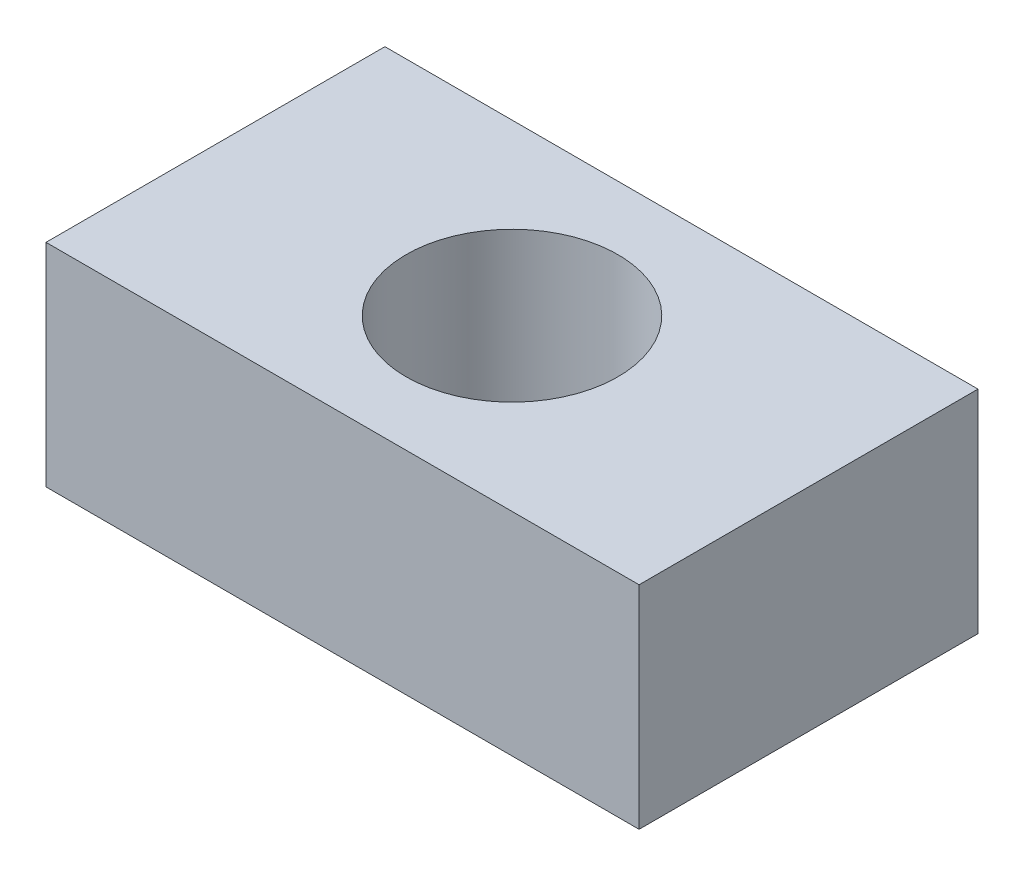
ISO-10303-21;
HEADER;
FILE_DESCRIPTION(('STEP AP214'),'2;1');
FILE_NAME('part.step','',(''),(''),'','','');
FILE_SCHEMA(('AUTOMOTIVE_DESIGN { 1 0 10303 214 1 1 1 1 }'));
ENDSEC;
DATA;
#1=APPLICATION_CONTEXT('core data for automotive mechanical design processes');
#2=APPLICATION_PROTOCOL_DEFINITION('international standard','automotive_design',2000,#1);
#3=PRODUCT_CONTEXT('',#1,'mechanical');
#4=PRODUCT('Part','Part','',(#3));
#5=PRODUCT_RELATED_PRODUCT_CATEGORY('part','',(#4));
#6=PRODUCT_DEFINITION_FORMATION('','',#4);
#7=PRODUCT_DEFINITION_CONTEXT('part definition',#1,'design');
#8=PRODUCT_DEFINITION('design','',#6,#7);
#9=PRODUCT_DEFINITION_SHAPE('','',#8);
#10=(LENGTH_UNIT() NAMED_UNIT(*) SI_UNIT(.MILLI.,.METRE.));
#11=(NAMED_UNIT(*) PLANE_ANGLE_UNIT() SI_UNIT($,.RADIAN.));
#12=(NAMED_UNIT(*) SI_UNIT($,.STERADIAN.) SOLID_ANGLE_UNIT());
#13=UNCERTAINTY_MEASURE_WITH_UNIT(LENGTH_MEASURE(1.E-05),#10,'distance_accuracy_value','');
#14=(GEOMETRIC_REPRESENTATION_CONTEXT(3) GLOBAL_UNCERTAINTY_ASSIGNED_CONTEXT((#13)) GLOBAL_UNIT_ASSIGNED_CONTEXT((#10,
#11,#12)) REPRESENTATION_CONTEXT('',''));
#15=CARTESIAN_POINT('',(0.,0.,0.));
#16=DIRECTION('',(0.,0.,1.));
#17=DIRECTION('',(1.,0.,0.));
#18=AXIS2_PLACEMENT_3D('',#15,#16,#17);
#19=CARTESIAN_POINT('',(0.,2.5,0.));
#20=DIRECTION('',(0.,-1.,0.));
#21=DIRECTION('',(0.,0.,-1.));
#22=AXIS2_PLACEMENT_3D('',#19,#20,#21);
#23=PLANE('',#22);
#24=DIRECTION('',(0.,0.,-1.));
#25=VECTOR('',#24,1.);
#26=CARTESIAN_POINT('',(7.,2.5,4.));
#27=LINE('',#26,#25);
#28=CARTESIAN_POINT('',(7.,2.5,4.));
#29=VERTEX_POINT('',#28);
#30=CARTESIAN_POINT('',(7.,2.5,-4.));
#31=VERTEX_POINT('',#30);
#32=EDGE_CURVE('E91',#29,#31,#27,.T.);
#33=ORIENTED_EDGE('',*,*,#32,.T.);
#34=DIRECTION('',(-1.,0.,0.));
#35=VECTOR('',#34,1.);
#36=CARTESIAN_POINT('',(-7.,2.5,-4.));
#37=LINE('',#36,#35);
#38=CARTESIAN_POINT('',(-7.,2.5,-4.));
#39=VERTEX_POINT('',#38);
#40=EDGE_CURVE('E86',#31,#39,#37,.T.);
#41=ORIENTED_EDGE('',*,*,#40,.T.);
#42=DIRECTION('',(0.,0.,1.));
#43=VECTOR('',#42,1.);
#44=CARTESIAN_POINT('',(-7.,2.5,4.));
#45=LINE('',#44,#43);
#46=CARTESIAN_POINT('',(-7.,2.5,4.));
#47=VERTEX_POINT('',#46);
#48=EDGE_CURVE('E87',#39,#47,#45,.T.);
#49=ORIENTED_EDGE('',*,*,#48,.T.);
#50=DIRECTION('',(1.,0.,0.));
#51=VECTOR('',#50,1.);
#52=CARTESIAN_POINT('',(-7.,2.5,4.));
#53=LINE('',#52,#51);
#54=EDGE_CURVE('E57',#47,#29,#53,.T.);
#55=ORIENTED_EDGE('',*,*,#54,.T.);
#56=EDGE_LOOP('',(#33,#41,#49,#55));
#57=FACE_BOUND('',#56,.T.);
#58=CARTESIAN_POINT('',(0.,2.5,0.));
#59=DIRECTION('',(0.,1.,0.));
#60=DIRECTION('',(0.,0.,1.));
#61=AXIS2_PLACEMENT_3D('',#58,#59,#60);
#62=CIRCLE('',#61,2.5);
#63=CARTESIAN_POINT('',(0.,2.5,2.5));
#64=VERTEX_POINT('',#63);
#65=EDGE_CURVE('E106',#64,#64,#62,.T.);
#66=ORIENTED_EDGE('',*,*,#65,.F.);
#67=EDGE_LOOP('',(#66));
#68=FACE_BOUND('',#67,.T.);
#69=ADVANCED_FACE('F39',(#57,#68),#23,.F.);
#70=CARTESIAN_POINT('',(0.,-2.5,0.));
#71=DIRECTION('',(0.,-1.,0.));
#72=DIRECTION('',(0.,0.,-1.));
#73=AXIS2_PLACEMENT_3D('',#70,#71,#72);
#74=PLANE('',#73);
#75=DIRECTION('',(0.,0.,-1.));
#76=VECTOR('',#75,1.);
#77=CARTESIAN_POINT('',(7.,-2.5,4.));
#78=LINE('',#77,#76);
#79=CARTESIAN_POINT('',(7.,-2.5,4.));
#80=VERTEX_POINT('',#79);
#81=CARTESIAN_POINT('',(7.,-2.5,-4.));
#82=VERTEX_POINT('',#81);
#83=EDGE_CURVE('E104',#80,#82,#78,.T.);
#84=ORIENTED_EDGE('',*,*,#83,.F.);
#85=DIRECTION('',(1.,0.,0.));
#86=VECTOR('',#85,1.);
#87=CARTESIAN_POINT('',(-7.,-2.5,4.));
#88=LINE('',#87,#86);
#89=CARTESIAN_POINT('',(-7.,-2.5,4.));
#90=VERTEX_POINT('',#89);
#91=EDGE_CURVE('E80',#90,#80,#88,.T.);
#92=ORIENTED_EDGE('',*,*,#91,.F.);
#93=DIRECTION('',(0.,0.,1.));
#94=VECTOR('',#93,1.);
#95=CARTESIAN_POINT('',(-7.,-2.5,4.));
#96=LINE('',#95,#94);
#97=CARTESIAN_POINT('',(-7.,-2.5,-4.));
#98=VERTEX_POINT('',#97);
#99=EDGE_CURVE('E74',#98,#90,#96,.T.);
#100=ORIENTED_EDGE('',*,*,#99,.F.);
#101=DIRECTION('',(-1.,0.,0.));
#102=VECTOR('',#101,1.);
#103=CARTESIAN_POINT('',(-7.,-2.5,-4.));
#104=LINE('',#103,#102);
#105=EDGE_CURVE('E94',#82,#98,#104,.T.);
#106=ORIENTED_EDGE('',*,*,#105,.F.);
#107=EDGE_LOOP('',(#84,#92,#100,#106));
#108=FACE_BOUND('',#107,.T.);
#109=CARTESIAN_POINT('',(0.,-2.5,0.));
#110=DIRECTION('',(0.,1.,0.));
#111=DIRECTION('',(0.,0.,1.));
#112=AXIS2_PLACEMENT_3D('',#109,#110,#111);
#113=CIRCLE('',#112,2.5);
#114=CARTESIAN_POINT('',(0.,-2.5,2.5));
#115=VERTEX_POINT('',#114);
#116=EDGE_CURVE('E119',#115,#115,#113,.T.);
#117=ORIENTED_EDGE('',*,*,#116,.T.);
#118=EDGE_LOOP('',(#117));
#119=FACE_BOUND('',#118,.T.);
#120=ADVANCED_FACE('F114',(#108,#119),#74,.T.);
#121=CARTESIAN_POINT('',(7.,2.5,4.));
#122=DIRECTION('',(-1.,0.,0.));
#123=DIRECTION('',(0.,0.,1.));
#124=AXIS2_PLACEMENT_3D('',#121,#122,#123);
#125=PLANE('',#124);
#126=ORIENTED_EDGE('',*,*,#83,.T.);
#127=DIRECTION('',(0.,-1.,0.));
#128=VECTOR('',#127,1.);
#129=CARTESIAN_POINT('',(7.,2.5,-4.));
#130=LINE('',#129,#128);
#131=EDGE_CURVE('E11',#31,#82,#130,.T.);
#132=ORIENTED_EDGE('',*,*,#131,.F.);
#133=ORIENTED_EDGE('',*,*,#32,.F.);
#134=DIRECTION('',(0.,-1.,0.));
#135=VECTOR('',#134,1.);
#136=CARTESIAN_POINT('',(7.,2.5,4.));
#137=LINE('',#136,#135);
#138=EDGE_CURVE('E98',#29,#80,#137,.T.);
#139=ORIENTED_EDGE('',*,*,#138,.T.);
#140=EDGE_LOOP('',(#126,#132,#133,#139));
#141=FACE_BOUND('',#140,.T.);
#142=ADVANCED_FACE('F41',(#141),#125,.F.);
#143=CARTESIAN_POINT('',(-7.,2.5,-4.));
#144=DIRECTION('',(0.,0.,1.));
#145=DIRECTION('',(1.,0.,0.));
#146=AXIS2_PLACEMENT_3D('',#143,#144,#145);
#147=PLANE('',#146);
#148=ORIENTED_EDGE('',*,*,#105,.T.);
#149=DIRECTION('',(0.,-1.,0.));
#150=VECTOR('',#149,1.);
#151=CARTESIAN_POINT('',(-7.,2.5,-4.));
#152=LINE('',#151,#150);
#153=EDGE_CURVE('E48',#39,#98,#152,.T.);
#154=ORIENTED_EDGE('',*,*,#153,.F.);
#155=ORIENTED_EDGE('',*,*,#40,.F.);
#156=ORIENTED_EDGE('',*,*,#131,.T.);
#157=EDGE_LOOP('',(#148,#154,#155,#156));
#158=FACE_BOUND('',#157,.T.);
#159=ADVANCED_FACE('F92',(#158),#147,.F.);
#160=CARTESIAN_POINT('',(-7.,2.5,4.));
#161=DIRECTION('',(1.,0.,0.));
#162=DIRECTION('',(0.,0.,-1.));
#163=AXIS2_PLACEMENT_3D('',#160,#161,#162);
#164=PLANE('',#163);
#165=ORIENTED_EDGE('',*,*,#99,.T.);
#166=DIRECTION('',(0.,-1.,0.));
#167=VECTOR('',#166,1.);
#168=CARTESIAN_POINT('',(-7.,2.5,4.));
#169=LINE('',#168,#167);
#170=EDGE_CURVE('E96',#47,#90,#169,.T.);
#171=ORIENTED_EDGE('',*,*,#170,.F.);
#172=ORIENTED_EDGE('',*,*,#48,.F.);
#173=ORIENTED_EDGE('',*,*,#153,.T.);
#174=EDGE_LOOP('',(#165,#171,#172,#173));
#175=FACE_BOUND('',#174,.T.);
#176=ADVANCED_FACE('F100',(#175),#164,.F.);
#177=CARTESIAN_POINT('',(-7.,2.5,4.));
#178=DIRECTION('',(0.,0.,-1.));
#179=DIRECTION('',(-1.,0.,0.));
#180=AXIS2_PLACEMENT_3D('',#177,#178,#179);
#181=PLANE('',#180);
#182=ORIENTED_EDGE('',*,*,#91,.T.);
#183=ORIENTED_EDGE('',*,*,#138,.F.);
#184=ORIENTED_EDGE('',*,*,#54,.F.);
#185=ORIENTED_EDGE('',*,*,#170,.T.);
#186=EDGE_LOOP('',(#182,#183,#184,#185));
#187=FACE_BOUND('',#186,.T.);
#188=ADVANCED_FACE('F112',(#187),#181,.F.);
#189=CARTESIAN_POINT('',(0.,2.5,0.));
#190=DIRECTION('',(0.,-1.,0.));
#191=DIRECTION('',(0.,0.,-1.));
#192=AXIS2_PLACEMENT_3D('',#189,#190,#191);
#193=CYLINDRICAL_SURFACE('',#192,2.5);
#194=ORIENTED_EDGE('',*,*,#65,.T.);
#195=EDGE_LOOP('',(#194));
#196=FACE_BOUND('',#195,.T.);
#197=ORIENTED_EDGE('',*,*,#116,.F.);
#198=EDGE_LOOP('',(#197));
#199=FACE_BOUND('',#198,.T.);
#200=ADVANCED_FACE('F125',(#196,#199),#193,.F.);
#201=CLOSED_SHELL('',(#69,#120,#142,#159,#176,#188,#200));
#202=MANIFOLD_SOLID_BREP('B2',#201);
#203=ADVANCED_BREP_SHAPE_REPRESENTATION('',(#18,#202),#14);
#204=SHAPE_DEFINITION_REPRESENTATION(#9,#203);
ENDSEC;
END-ISO-10303-21;
